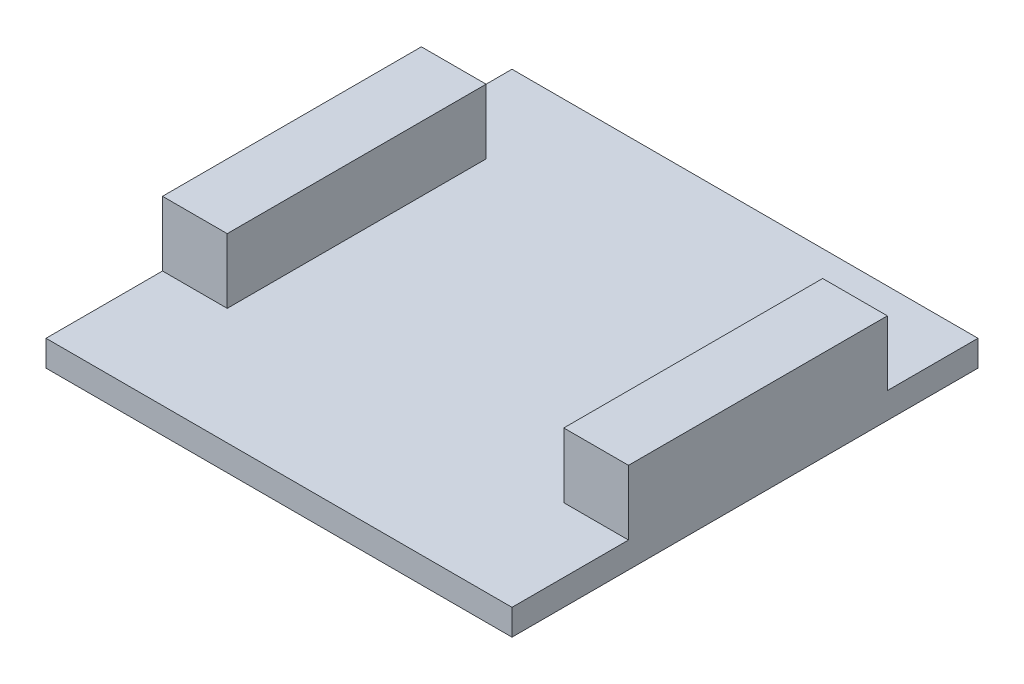
ISO-10303-21;
HEADER;
FILE_DESCRIPTION(('STEP AP214'),'2;1');
FILE_NAME('part.step','',(''),(''),'','','');
FILE_SCHEMA(('AUTOMOTIVE_DESIGN { 1 0 10303 214 1 1 1 1 }'));
ENDSEC;
DATA;
#1=APPLICATION_CONTEXT('core data for automotive mechanical design processes');
#2=APPLICATION_PROTOCOL_DEFINITION('international standard','automotive_design',2000,#1);
#3=PRODUCT_CONTEXT('',#1,'mechanical');
#4=PRODUCT('Part','Part','',(#3));
#5=PRODUCT_RELATED_PRODUCT_CATEGORY('part','',(#4));
#6=PRODUCT_DEFINITION_FORMATION('','',#4);
#7=PRODUCT_DEFINITION_CONTEXT('part definition',#1,'design');
#8=PRODUCT_DEFINITION('design','',#6,#7);
#9=PRODUCT_DEFINITION_SHAPE('','',#8);
#10=(LENGTH_UNIT() NAMED_UNIT(*) SI_UNIT(.MILLI.,.METRE.));
#11=(NAMED_UNIT(*) PLANE_ANGLE_UNIT() SI_UNIT($,.RADIAN.));
#12=(NAMED_UNIT(*) SI_UNIT($,.STERADIAN.) SOLID_ANGLE_UNIT());
#13=UNCERTAINTY_MEASURE_WITH_UNIT(LENGTH_MEASURE(1.E-05),#10,'distance_accuracy_value','');
#14=(GEOMETRIC_REPRESENTATION_CONTEXT(3) GLOBAL_UNCERTAINTY_ASSIGNED_CONTEXT((#13)) GLOBAL_UNIT_ASSIGNED_CONTEXT((#10,
#11,#12)) REPRESENTATION_CONTEXT('',''));
#15=CARTESIAN_POINT('',(0.,0.,0.));
#16=DIRECTION('',(0.,0.,1.));
#17=DIRECTION('',(1.,0.,0.));
#18=AXIS2_PLACEMENT_3D('',#15,#16,#17);
#19=CARTESIAN_POINT('',(0.,1.,0.));
#20=DIRECTION('',(0.,-1.,0.));
#21=DIRECTION('',(0.,0.,-1.));
#22=AXIS2_PLACEMENT_3D('',#19,#20,#21);
#23=PLANE('',#22);
#24=DIRECTION('',(-1.,0.,0.));
#25=VECTOR('',#24,1.);
#26=CARTESIAN_POINT('',(18.,1.,-14.5));
#27=LINE('',#26,#25);
#28=CARTESIAN_POINT('',(18.,1.,-14.5));
#29=VERTEX_POINT('',#28);
#30=CARTESIAN_POINT('',(15.5,1.,-14.5));
#31=VERTEX_POINT('',#30);
#32=EDGE_CURVE('E142',#29,#31,#27,.T.);
#33=ORIENTED_EDGE('',*,*,#32,.F.);
#34=DIRECTION('',(0.,0.,-1.));
#35=VECTOR('',#34,1.);
#36=CARTESIAN_POINT('',(18.,1.,0.));
#37=LINE('',#36,#35);
#38=CARTESIAN_POINT('',(18.,1.,-18.));
#39=VERTEX_POINT('',#38);
#40=EDGE_CURVE('E184',#29,#39,#37,.T.);
#41=ORIENTED_EDGE('',*,*,#40,.T.);
#42=DIRECTION('',(-1.,0.,0.));
#43=VECTOR('',#42,1.);
#44=CARTESIAN_POINT('',(0.,1.,-18.));
#45=LINE('',#44,#43);
#46=CARTESIAN_POINT('',(0.,1.,-18.));
#47=VERTEX_POINT('',#46);
#48=EDGE_CURVE('E187',#39,#47,#45,.T.);
#49=ORIENTED_EDGE('',*,*,#48,.T.);
#50=DIRECTION('',(0.,0.,1.));
#51=VECTOR('',#50,1.);
#52=CARTESIAN_POINT('',(0.,1.,0.));
#53=LINE('',#52,#51);
#54=CARTESIAN_POINT('',(0.,1.,-14.5));
#55=VERTEX_POINT('',#54);
#56=EDGE_CURVE('E179',#47,#55,#53,.T.);
#57=ORIENTED_EDGE('',*,*,#56,.T.);
#58=DIRECTION('',(-1.,0.,0.));
#59=VECTOR('',#58,1.);
#60=CARTESIAN_POINT('',(0.,1.,-14.5));
#61=LINE('',#60,#59);
#62=CARTESIAN_POINT('',(2.5,1.,-14.5));
#63=VERTEX_POINT('',#62);
#64=EDGE_CURVE('E156',#63,#55,#61,.T.);
#65=ORIENTED_EDGE('',*,*,#64,.F.);
#66=DIRECTION('',(0.,0.,-1.));
#67=VECTOR('',#66,1.);
#68=CARTESIAN_POINT('',(2.5,1.,-14.5));
#69=LINE('',#68,#67);
#70=CARTESIAN_POINT('',(2.5,1.,-4.5));
#71=VERTEX_POINT('',#70);
#72=EDGE_CURVE('E146',#71,#63,#69,.T.);
#73=ORIENTED_EDGE('',*,*,#72,.F.);
#74=DIRECTION('',(1.,0.,0.));
#75=VECTOR('',#74,1.);
#76=CARTESIAN_POINT('',(0.,1.,-4.5));
#77=LINE('',#76,#75);
#78=CARTESIAN_POINT('',(0.,1.,-4.5));
#79=VERTEX_POINT('',#78);
#80=EDGE_CURVE('E143',#79,#71,#77,.T.);
#81=ORIENTED_EDGE('',*,*,#80,.F.);
#82=CARTESIAN_POINT('',(0.,1.,0.));
#83=VERTEX_POINT('',#82);
#84=EDGE_CURVE('E182',#79,#83,#53,.T.);
#85=ORIENTED_EDGE('',*,*,#84,.T.);
#86=DIRECTION('',(1.,0.,0.));
#87=VECTOR('',#86,1.);
#88=CARTESIAN_POINT('',(0.,1.,0.));
#89=LINE('',#88,#87);
#90=CARTESIAN_POINT('',(18.,1.,0.));
#91=VERTEX_POINT('',#90);
#92=EDGE_CURVE('E181',#83,#91,#89,.T.);
#93=ORIENTED_EDGE('',*,*,#92,.T.);
#94=CARTESIAN_POINT('',(18.,1.,-4.5));
#95=VERTEX_POINT('',#94);
#96=EDGE_CURVE('E185',#91,#95,#37,.T.);
#97=ORIENTED_EDGE('',*,*,#96,.T.);
#98=DIRECTION('',(1.,0.,0.));
#99=VECTOR('',#98,1.);
#100=CARTESIAN_POINT('',(18.,1.,-4.5));
#101=LINE('',#100,#99);
#102=CARTESIAN_POINT('',(15.5,1.,-4.5));
#103=VERTEX_POINT('',#102);
#104=EDGE_CURVE('E53',#103,#95,#101,.T.);
#105=ORIENTED_EDGE('',*,*,#104,.F.);
#106=DIRECTION('',(0.,0.,1.));
#107=VECTOR('',#106,1.);
#108=CARTESIAN_POINT('',(15.5,1.,-14.5));
#109=LINE('',#108,#107);
#110=EDGE_CURVE('E48',#31,#103,#109,.T.);
#111=ORIENTED_EDGE('',*,*,#110,.F.);
#112=EDGE_LOOP('',(#33,#41,#49,#57,#65,#73,#81,#85,#93,#97,#105,#111));
#113=FACE_BOUND('',#112,.T.);
#114=ADVANCED_FACE('F33',(#113),#23,.F.);
#115=CARTESIAN_POINT('',(0.,1.,0.));
#116=DIRECTION('',(1.,0.,0.));
#117=DIRECTION('',(0.,0.,-1.));
#118=AXIS2_PLACEMENT_3D('',#115,#116,#117);
#119=PLANE('',#118);
#120=DIRECTION('',(0.,0.,1.));
#121=VECTOR('',#120,1.);
#122=CARTESIAN_POINT('',(0.,0.,0.));
#123=LINE('',#122,#121);
#124=CARTESIAN_POINT('',(0.,0.,-18.));
#125=VERTEX_POINT('',#124);
#126=CARTESIAN_POINT('',(0.,0.,0.));
#127=VERTEX_POINT('',#126);
#128=EDGE_CURVE('E178',#125,#127,#123,.T.);
#129=ORIENTED_EDGE('',*,*,#128,.T.);
#130=DIRECTION('',(0.,-1.,0.));
#131=VECTOR('',#130,1.);
#132=CARTESIAN_POINT('',(0.,1.,0.));
#133=LINE('',#132,#131);
#134=EDGE_CURVE('E11',#83,#127,#133,.T.);
#135=ORIENTED_EDGE('',*,*,#134,.F.);
#136=ORIENTED_EDGE('',*,*,#84,.F.);
#137=DIRECTION('',(0.,-1.,0.));
#138=VECTOR('',#137,1.);
#139=CARTESIAN_POINT('',(0.,3.5,-4.5));
#140=LINE('',#139,#138);
#141=CARTESIAN_POINT('',(0.,3.5,-4.5));
#142=VERTEX_POINT('',#141);
#143=EDGE_CURVE('E175',#142,#79,#140,.T.);
#144=ORIENTED_EDGE('',*,*,#143,.F.);
#145=DIRECTION('',(0.,0.,1.));
#146=VECTOR('',#145,1.);
#147=CARTESIAN_POINT('',(0.,3.5,-14.5));
#148=LINE('',#147,#146);
#149=CARTESIAN_POINT('',(0.,3.5,-14.5));
#150=VERTEX_POINT('',#149);
#151=EDGE_CURVE('E152',#150,#142,#148,.T.);
#152=ORIENTED_EDGE('',*,*,#151,.F.);
#153=DIRECTION('',(0.,-1.,0.));
#154=VECTOR('',#153,1.);
#155=CARTESIAN_POINT('',(0.,3.5,-14.5));
#156=LINE('',#155,#154);
#157=EDGE_CURVE('E161',#150,#55,#156,.T.);
#158=ORIENTED_EDGE('',*,*,#157,.T.);
#159=ORIENTED_EDGE('',*,*,#56,.F.);
#160=DIRECTION('',(0.,-1.,0.));
#161=VECTOR('',#160,1.);
#162=CARTESIAN_POINT('',(0.,1.,-18.));
#163=LINE('',#162,#161);
#164=EDGE_CURVE('E189',#47,#125,#163,.T.);
#165=ORIENTED_EDGE('',*,*,#164,.T.);
#166=EDGE_LOOP('',(#129,#135,#136,#144,#152,#158,#159,#165));
#167=FACE_BOUND('',#166,.T.);
#168=ADVANCED_FACE('F35',(#167),#119,.F.);
#169=CARTESIAN_POINT('',(0.,1.,0.));
#170=DIRECTION('',(0.,0.,-1.));
#171=DIRECTION('',(-1.,0.,0.));
#172=AXIS2_PLACEMENT_3D('',#169,#170,#171);
#173=PLANE('',#172);
#174=DIRECTION('',(1.,0.,0.));
#175=VECTOR('',#174,1.);
#176=CARTESIAN_POINT('',(0.,0.,0.));
#177=LINE('',#176,#175);
#178=CARTESIAN_POINT('',(18.,0.,0.));
#179=VERTEX_POINT('',#178);
#180=EDGE_CURVE('E192',#127,#179,#177,.T.);
#181=ORIENTED_EDGE('',*,*,#180,.T.);
#182=DIRECTION('',(0.,-1.,0.));
#183=VECTOR('',#182,1.);
#184=CARTESIAN_POINT('',(18.,1.,0.));
#185=LINE('',#184,#183);
#186=EDGE_CURVE('E41',#91,#179,#185,.T.);
#187=ORIENTED_EDGE('',*,*,#186,.F.);
#188=ORIENTED_EDGE('',*,*,#92,.F.);
#189=ORIENTED_EDGE('',*,*,#134,.T.);
#190=EDGE_LOOP('',(#181,#187,#188,#189));
#191=FACE_BOUND('',#190,.T.);
#192=ADVANCED_FACE('F237',(#191),#173,.F.);
#193=CARTESIAN_POINT('',(18.,1.,0.));
#194=DIRECTION('',(-1.,0.,0.));
#195=DIRECTION('',(0.,0.,1.));
#196=AXIS2_PLACEMENT_3D('',#193,#194,#195);
#197=PLANE('',#196);
#198=DIRECTION('',(0.,0.,-1.));
#199=VECTOR('',#198,1.);
#200=CARTESIAN_POINT('',(18.,0.,0.));
#201=LINE('',#200,#199);
#202=CARTESIAN_POINT('',(18.,0.,-18.));
#203=VERTEX_POINT('',#202);
#204=EDGE_CURVE('E194',#179,#203,#201,.T.);
#205=ORIENTED_EDGE('',*,*,#204,.T.);
#206=DIRECTION('',(0.,-1.,0.));
#207=VECTOR('',#206,1.);
#208=CARTESIAN_POINT('',(18.,1.,-18.));
#209=LINE('',#208,#207);
#210=EDGE_CURVE('E200',#39,#203,#209,.T.);
#211=ORIENTED_EDGE('',*,*,#210,.F.);
#212=ORIENTED_EDGE('',*,*,#40,.F.);
#213=DIRECTION('',(0.,-1.,0.));
#214=VECTOR('',#213,1.);
#215=CARTESIAN_POINT('',(18.,3.5,-14.5));
#216=LINE('',#215,#214);
#217=CARTESIAN_POINT('',(18.,3.5,-14.5));
#218=VERTEX_POINT('',#217);
#219=EDGE_CURVE('E360',#218,#29,#216,.T.);
#220=ORIENTED_EDGE('',*,*,#219,.F.);
#221=DIRECTION('',(0.,0.,-1.));
#222=VECTOR('',#221,1.);
#223=CARTESIAN_POINT('',(18.,3.5,-14.5));
#224=LINE('',#223,#222);
#225=CARTESIAN_POINT('',(18.,3.5,-4.5));
#226=VERTEX_POINT('',#225);
#227=EDGE_CURVE('E136',#226,#218,#224,.T.);
#228=ORIENTED_EDGE('',*,*,#227,.F.);
#229=DIRECTION('',(0.,-1.,0.));
#230=VECTOR('',#229,1.);
#231=CARTESIAN_POINT('',(18.,3.5,-4.5));
#232=LINE('',#231,#230);
#233=EDGE_CURVE('E148',#226,#95,#232,.T.);
#234=ORIENTED_EDGE('',*,*,#233,.T.);
#235=ORIENTED_EDGE('',*,*,#96,.F.);
#236=ORIENTED_EDGE('',*,*,#186,.T.);
#237=EDGE_LOOP('',(#205,#211,#212,#220,#228,#234,#235,#236));
#238=FACE_BOUND('',#237,.T.);
#239=ADVANCED_FACE('F207',(#238),#197,.F.);
#240=CARTESIAN_POINT('',(0.,1.,-18.));
#241=DIRECTION('',(0.,0.,1.));
#242=DIRECTION('',(1.,0.,0.));
#243=AXIS2_PLACEMENT_3D('',#240,#241,#242);
#244=PLANE('',#243);
#245=DIRECTION('',(-1.,0.,0.));
#246=VECTOR('',#245,1.);
#247=CARTESIAN_POINT('',(0.,0.,-18.));
#248=LINE('',#247,#246);
#249=EDGE_CURVE('E196',#203,#125,#248,.T.);
#250=ORIENTED_EDGE('',*,*,#249,.T.);
#251=ORIENTED_EDGE('',*,*,#164,.F.);
#252=ORIENTED_EDGE('',*,*,#48,.F.);
#253=ORIENTED_EDGE('',*,*,#210,.T.);
#254=EDGE_LOOP('',(#250,#251,#252,#253));
#255=FACE_BOUND('',#254,.T.);
#256=ADVANCED_FACE('F218',(#255),#244,.F.);
#257=CARTESIAN_POINT('',(0.,0.,0.));
#258=DIRECTION('',(0.,-1.,0.));
#259=DIRECTION('',(0.,0.,-1.));
#260=AXIS2_PLACEMENT_3D('',#257,#258,#259);
#261=PLANE('',#260);
#262=ORIENTED_EDGE('',*,*,#128,.F.);
#263=ORIENTED_EDGE('',*,*,#249,.F.);
#264=ORIENTED_EDGE('',*,*,#204,.F.);
#265=ORIENTED_EDGE('',*,*,#180,.F.);
#266=EDGE_LOOP('',(#262,#263,#264,#265));
#267=FACE_BOUND('',#266,.T.);
#268=ADVANCED_FACE('F215',(#267),#261,.T.);
#269=CARTESIAN_POINT('',(0.,3.5,-4.5));
#270=DIRECTION('',(0.,0.,-1.));
#271=DIRECTION('',(-1.,0.,0.));
#272=AXIS2_PLACEMENT_3D('',#269,#270,#271);
#273=PLANE('',#272);
#274=ORIENTED_EDGE('',*,*,#80,.T.);
#275=DIRECTION('',(0.,-1.,0.));
#276=VECTOR('',#275,1.);
#277=CARTESIAN_POINT('',(2.5,3.5,-4.5));
#278=LINE('',#277,#276);
#279=CARTESIAN_POINT('',(2.5,3.5,-4.5));
#280=VERTEX_POINT('',#279);
#281=EDGE_CURVE('E172',#280,#71,#278,.T.);
#282=ORIENTED_EDGE('',*,*,#281,.F.);
#283=DIRECTION('',(1.,0.,0.));
#284=VECTOR('',#283,1.);
#285=CARTESIAN_POINT('',(0.,3.5,-4.5));
#286=LINE('',#285,#284);
#287=EDGE_CURVE('E155',#142,#280,#286,.T.);
#288=ORIENTED_EDGE('',*,*,#287,.F.);
#289=ORIENTED_EDGE('',*,*,#143,.T.);
#290=EDGE_LOOP('',(#274,#282,#288,#289));
#291=FACE_BOUND('',#290,.T.);
#292=ADVANCED_FACE('F235',(#291),#273,.F.);
#293=CARTESIAN_POINT('',(2.5,3.5,-14.5));
#294=DIRECTION('',(-1.,0.,0.));
#295=DIRECTION('',(0.,0.,1.));
#296=AXIS2_PLACEMENT_3D('',#293,#294,#295);
#297=PLANE('',#296);
#298=ORIENTED_EDGE('',*,*,#72,.T.);
#299=DIRECTION('',(0.,-1.,0.));
#300=VECTOR('',#299,1.);
#301=CARTESIAN_POINT('',(2.5,3.5,-14.5));
#302=LINE('',#301,#300);
#303=CARTESIAN_POINT('',(2.5,3.5,-14.5));
#304=VERTEX_POINT('',#303);
#305=EDGE_CURVE('E169',#304,#63,#302,.T.);
#306=ORIENTED_EDGE('',*,*,#305,.F.);
#307=DIRECTION('',(0.,0.,-1.));
#308=VECTOR('',#307,1.);
#309=CARTESIAN_POINT('',(2.5,3.5,-14.5));
#310=LINE('',#309,#308);
#311=EDGE_CURVE('E158',#280,#304,#310,.T.);
#312=ORIENTED_EDGE('',*,*,#311,.F.);
#313=ORIENTED_EDGE('',*,*,#281,.T.);
#314=EDGE_LOOP('',(#298,#306,#312,#313));
#315=FACE_BOUND('',#314,.T.);
#316=ADVANCED_FACE('F231',(#315),#297,.F.);
#317=CARTESIAN_POINT('',(0.,3.5,-14.5));
#318=DIRECTION('',(0.,0.,1.));
#319=DIRECTION('',(1.,0.,0.));
#320=AXIS2_PLACEMENT_3D('',#317,#318,#319);
#321=PLANE('',#320);
#322=ORIENTED_EDGE('',*,*,#64,.T.);
#323=ORIENTED_EDGE('',*,*,#157,.F.);
#324=DIRECTION('',(-1.,0.,0.));
#325=VECTOR('',#324,1.);
#326=CARTESIAN_POINT('',(0.,3.5,-14.5));
#327=LINE('',#326,#325);
#328=EDGE_CURVE('E160',#304,#150,#327,.T.);
#329=ORIENTED_EDGE('',*,*,#328,.F.);
#330=ORIENTED_EDGE('',*,*,#305,.T.);
#331=EDGE_LOOP('',(#322,#323,#329,#330));
#332=FACE_BOUND('',#331,.T.);
#333=ADVANCED_FACE('F226',(#332),#321,.F.);
#334=CARTESIAN_POINT('',(0.,3.5,0.));
#335=DIRECTION('',(0.,1.,0.));
#336=DIRECTION('',(0.,0.,1.));
#337=AXIS2_PLACEMENT_3D('',#334,#335,#336);
#338=PLANE('',#337);
#339=ORIENTED_EDGE('',*,*,#151,.T.);
#340=ORIENTED_EDGE('',*,*,#287,.T.);
#341=ORIENTED_EDGE('',*,*,#311,.T.);
#342=ORIENTED_EDGE('',*,*,#328,.T.);
#343=EDGE_LOOP('',(#339,#340,#341,#342));
#344=FACE_BOUND('',#343,.T.);
#345=ADVANCED_FACE('F278',(#344),#338,.T.);
#346=CARTESIAN_POINT('',(18.,3.5,-14.5));
#347=DIRECTION('',(0.,0.,1.));
#348=DIRECTION('',(1.,0.,0.));
#349=AXIS2_PLACEMENT_3D('',#346,#347,#348);
#350=PLANE('',#349);
#351=ORIENTED_EDGE('',*,*,#32,.T.);
#352=DIRECTION('',(0.,-1.,0.));
#353=VECTOR('',#352,1.);
#354=CARTESIAN_POINT('',(15.5,3.5,-14.5));
#355=LINE('',#354,#353);
#356=CARTESIAN_POINT('',(15.5,3.5,-14.5));
#357=VERTEX_POINT('',#356);
#358=EDGE_CURVE('E124',#357,#31,#355,.T.);
#359=ORIENTED_EDGE('',*,*,#358,.F.);
#360=DIRECTION('',(-1.,0.,0.));
#361=VECTOR('',#360,1.);
#362=CARTESIAN_POINT('',(18.,3.5,-14.5));
#363=LINE('',#362,#361);
#364=EDGE_CURVE('E131',#218,#357,#363,.T.);
#365=ORIENTED_EDGE('',*,*,#364,.F.);
#366=ORIENTED_EDGE('',*,*,#219,.T.);
#367=EDGE_LOOP('',(#351,#359,#365,#366));
#368=FACE_BOUND('',#367,.T.);
#369=ADVANCED_FACE('F141',(#368),#350,.F.);
#370=CARTESIAN_POINT('',(15.5,3.5,-14.5));
#371=DIRECTION('',(1.,0.,0.));
#372=DIRECTION('',(0.,0.,-1.));
#373=AXIS2_PLACEMENT_3D('',#370,#371,#372);
#374=PLANE('',#373);
#375=ORIENTED_EDGE('',*,*,#110,.T.);
#376=DIRECTION('',(0.,-1.,0.));
#377=VECTOR('',#376,1.);
#378=CARTESIAN_POINT('',(15.5,3.5,-4.5));
#379=LINE('',#378,#377);
#380=CARTESIAN_POINT('',(15.5,3.5,-4.5));
#381=VERTEX_POINT('',#380);
#382=EDGE_CURVE('E127',#381,#103,#379,.T.);
#383=ORIENTED_EDGE('',*,*,#382,.F.);
#384=DIRECTION('',(0.,0.,1.));
#385=VECTOR('',#384,1.);
#386=CARTESIAN_POINT('',(15.5,3.5,-14.5));
#387=LINE('',#386,#385);
#388=EDGE_CURVE('E120',#357,#381,#387,.T.);
#389=ORIENTED_EDGE('',*,*,#388,.F.);
#390=ORIENTED_EDGE('',*,*,#358,.T.);
#391=EDGE_LOOP('',(#375,#383,#389,#390));
#392=FACE_BOUND('',#391,.T.);
#393=ADVANCED_FACE('F122',(#392),#374,.F.);
#394=CARTESIAN_POINT('',(18.,3.5,-4.5));
#395=DIRECTION('',(0.,0.,-1.));
#396=DIRECTION('',(-1.,0.,0.));
#397=AXIS2_PLACEMENT_3D('',#394,#395,#396);
#398=PLANE('',#397);
#399=ORIENTED_EDGE('',*,*,#104,.T.);
#400=ORIENTED_EDGE('',*,*,#233,.F.);
#401=DIRECTION('',(1.,0.,0.));
#402=VECTOR('',#401,1.);
#403=CARTESIAN_POINT('',(18.,3.5,-4.5));
#404=LINE('',#403,#402);
#405=EDGE_CURVE('E130',#381,#226,#404,.T.);
#406=ORIENTED_EDGE('',*,*,#405,.F.);
#407=ORIENTED_EDGE('',*,*,#382,.T.);
#408=EDGE_LOOP('',(#399,#400,#406,#407));
#409=FACE_BOUND('',#408,.T.);
#410=ADVANCED_FACE('F298',(#409),#398,.F.);
#411=CARTESIAN_POINT('',(0.,3.5,0.));
#412=DIRECTION('',(0.,1.,0.));
#413=DIRECTION('',(0.,0.,1.));
#414=AXIS2_PLACEMENT_3D('',#411,#412,#413);
#415=PLANE('',#414);
#416=ORIENTED_EDGE('',*,*,#364,.T.);
#417=ORIENTED_EDGE('',*,*,#388,.T.);
#418=ORIENTED_EDGE('',*,*,#405,.T.);
#419=ORIENTED_EDGE('',*,*,#227,.T.);
#420=EDGE_LOOP('',(#416,#417,#418,#419));
#421=FACE_BOUND('',#420,.T.);
#422=ADVANCED_FACE('F134',(#421),#415,.T.);
#423=CLOSED_SHELL('',(#114,#168,#192,#239,#256,#268,#292,#316,#333,#345,#369,#393,#410,#422));
#424=MANIFOLD_SOLID_BREP('B2',#423);
#425=ADVANCED_BREP_SHAPE_REPRESENTATION('',(#18,#424),#14);
#426=SHAPE_DEFINITION_REPRESENTATION(#9,#425);
ENDSEC;
END-ISO-10303-21;
